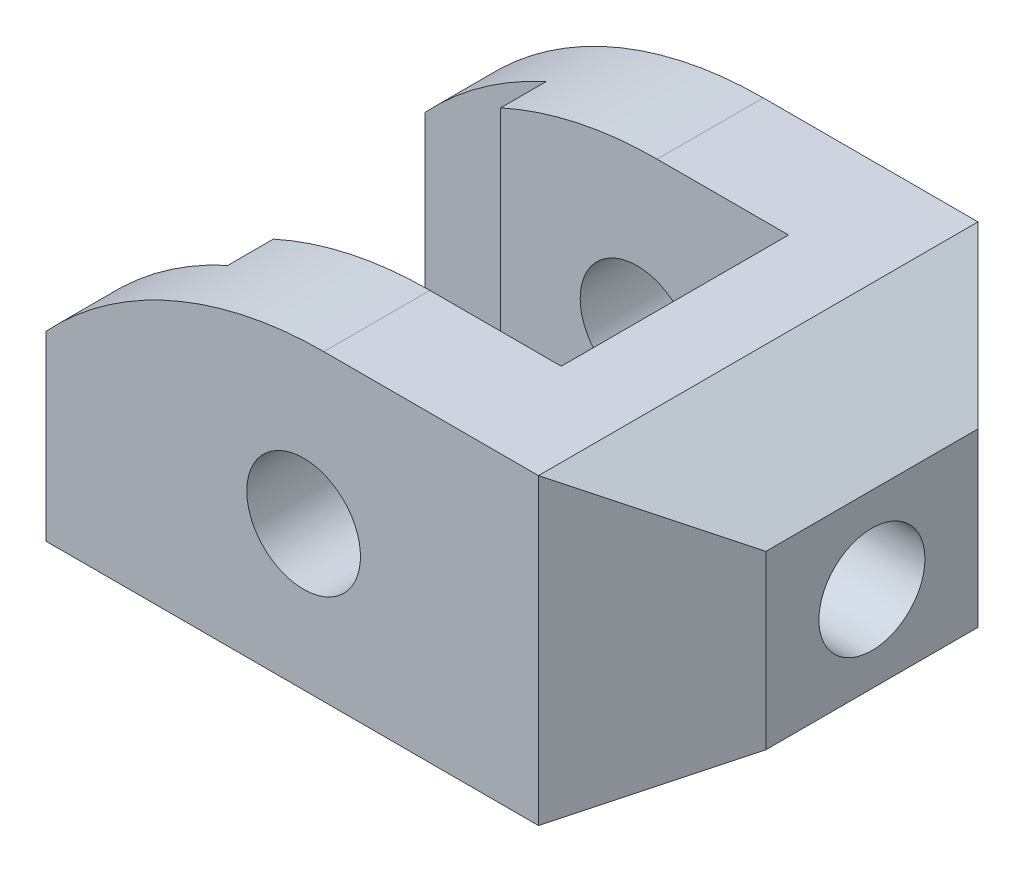
ISO-10303-21;
HEADER;
FILE_DESCRIPTION(('STEP AP214'),'2;1');
FILE_NAME('part.step','',(''),(''),'','','');
FILE_SCHEMA(('AUTOMOTIVE_DESIGN { 1 0 10303 214 1 1 1 1 }'));
ENDSEC;
DATA;
#1=APPLICATION_CONTEXT('core data for automotive mechanical design processes');
#2=APPLICATION_PROTOCOL_DEFINITION('international standard','automotive_design',2000,#1);
#3=PRODUCT_CONTEXT('',#1,'mechanical');
#4=PRODUCT('Part','Part','',(#3));
#5=PRODUCT_RELATED_PRODUCT_CATEGORY('part','',(#4));
#6=PRODUCT_DEFINITION_FORMATION('','',#4);
#7=PRODUCT_DEFINITION_CONTEXT('part definition',#1,'design');
#8=PRODUCT_DEFINITION('design','',#6,#7);
#9=PRODUCT_DEFINITION_SHAPE('','',#8);
#10=(LENGTH_UNIT() NAMED_UNIT(*) SI_UNIT(.MILLI.,.METRE.));
#11=(NAMED_UNIT(*) PLANE_ANGLE_UNIT() SI_UNIT($,.RADIAN.));
#12=(NAMED_UNIT(*) SI_UNIT($,.STERADIAN.) SOLID_ANGLE_UNIT());
#13=UNCERTAINTY_MEASURE_WITH_UNIT(LENGTH_MEASURE(1.E-05),#10,'distance_accuracy_value','');
#14=(GEOMETRIC_REPRESENTATION_CONTEXT(3) GLOBAL_UNCERTAINTY_ASSIGNED_CONTEXT((#13)) GLOBAL_UNIT_ASSIGNED_CONTEXT((#10,
#11,#12)) REPRESENTATION_CONTEXT('',''));
#15=CARTESIAN_POINT('',(0.,0.,0.));
#16=DIRECTION('',(0.,0.,1.));
#17=DIRECTION('',(1.,0.,0.));
#18=AXIS2_PLACEMENT_3D('',#15,#16,#17);
#19=CARTESIAN_POINT('',(36.6606055596467,-10.,29.));
#20=DIRECTION('',(0.,0.,-1.));
#21=DIRECTION('',(-1.,0.,0.));
#22=AXIS2_PLACEMENT_3D('',#19,#20,#21);
#23=CYLINDRICAL_SURFACE('',#22,50.);
#24=DIRECTION('',(0.,0.,-1.));
#25=VECTOR('',#24,1.);
#26=CARTESIAN_POINT('',(0.,24.,29.));
#27=LINE('',#26,#25);
#28=CARTESIAN_POINT('',(0.,24.,-21.));
#29=VERTEX_POINT('',#28);
#30=CARTESIAN_POINT('',(0.,24.,-29.));
#31=VERTEX_POINT('',#30);
#32=EDGE_CURVE('E261',#29,#31,#27,.T.);
#33=ORIENTED_EDGE('',*,*,#32,.F.);
#34=CARTESIAN_POINT('',(36.6606055596467,-10.,-21.));
#35=DIRECTION('',(0.,0.,-1.));
#36=DIRECTION('',(-1.,0.,0.));
#37=AXIS2_PLACEMENT_3D('',#34,#35,#36);
#38=CIRCLE('',#37,50.);
#39=CARTESIAN_POINT('',(16.,35.5317403347236,-21.));
#40=VERTEX_POINT('',#39);
#41=EDGE_CURVE('E222',#29,#40,#38,.T.);
#42=ORIENTED_EDGE('',*,*,#41,.T.);
#43=DIRECTION('',(0.,0.,-1.));
#44=VECTOR('',#43,1.);
#45=CARTESIAN_POINT('',(16.,35.5317403347236,29.));
#46=LINE('',#45,#44);
#47=CARTESIAN_POINT('',(16.,35.5317403347236,-15.));
#48=VERTEX_POINT('',#47);
#49=EDGE_CURVE('E287',#40,#48,#46,.F.);
#50=ORIENTED_EDGE('',*,*,#49,.T.);
#51=CARTESIAN_POINT('',(36.6606055596467,-10.,-15.));
#52=DIRECTION('',(0.,0.,-1.));
#53=DIRECTION('',(-1.,0.,0.));
#54=AXIS2_PLACEMENT_3D('',#51,#52,#53);
#55=CIRCLE('',#54,50.);
#56=CARTESIAN_POINT('',(36.6606055596467,40.,-15.));
#57=VERTEX_POINT('',#56);
#58=EDGE_CURVE('E217',#48,#57,#55,.T.);
#59=ORIENTED_EDGE('',*,*,#58,.T.);
#60=DIRECTION('',(0.,0.,-1.));
#61=VECTOR('',#60,1.);
#62=CARTESIAN_POINT('',(36.6606055596467,40.,29.));
#63=LINE('',#62,#61);
#64=CARTESIAN_POINT('',(36.6606055596467,40.,-29.));
#65=VERTEX_POINT('',#64);
#66=EDGE_CURVE('E179',#57,#65,#63,.T.);
#67=ORIENTED_EDGE('',*,*,#66,.T.);
#68=CARTESIAN_POINT('',(36.6606055596467,-10.,-29.));
#69=DIRECTION('',(0.,0.,1.));
#70=DIRECTION('',(-1.,0.,0.));
#71=AXIS2_PLACEMENT_3D('',#68,#69,#70);
#72=CIRCLE('',#71,50.);
#73=EDGE_CURVE('E253',#65,#31,#72,.T.);
#74=ORIENTED_EDGE('',*,*,#73,.T.);
#75=EDGE_LOOP('',(#33,#42,#50,#59,#67,#74));
#76=FACE_BOUND('',#75,.T.);
#77=ADVANCED_FACE('F42',(#76),#23,.T.);
#78=CARTESIAN_POINT('',(0.,0.,29.));
#79=DIRECTION('',(1.,0.,0.));
#80=DIRECTION('',(0.,0.,-1.));
#81=AXIS2_PLACEMENT_3D('',#78,#79,#80);
#82=PLANE('',#81);
#83=DIRECTION('',(0.,0.,-1.));
#84=VECTOR('',#83,1.);
#85=CARTESIAN_POINT('',(0.,0.,29.));
#86=LINE('',#85,#84);
#87=CARTESIAN_POINT('',(0.,0.,-21.));
#88=VERTEX_POINT('',#87);
#89=CARTESIAN_POINT('',(0.,0.,-29.));
#90=VERTEX_POINT('',#89);
#91=EDGE_CURVE('E248',#88,#90,#86,.T.);
#92=ORIENTED_EDGE('',*,*,#91,.F.);
#93=DIRECTION('',(0.,1.,0.));
#94=VECTOR('',#93,1.);
#95=CARTESIAN_POINT('',(0.,0.,-21.));
#96=LINE('',#95,#94);
#97=EDGE_CURVE('E184',#88,#29,#96,.T.);
#98=ORIENTED_EDGE('',*,*,#97,.T.);
#99=ORIENTED_EDGE('',*,*,#32,.T.);
#100=DIRECTION('',(0.,-1.,0.));
#101=VECTOR('',#100,1.);
#102=CARTESIAN_POINT('',(0.,0.,-29.));
#103=LINE('',#102,#101);
#104=EDGE_CURVE('E242',#31,#90,#103,.T.);
#105=ORIENTED_EDGE('',*,*,#104,.T.);
#106=EDGE_LOOP('',(#92,#98,#99,#105));
#107=FACE_BOUND('',#106,.T.);
#108=ADVANCED_FACE('F344',(#107),#82,.F.);
#109=CARTESIAN_POINT('',(34.,19.,29.));
#110=DIRECTION('',(0.,0.,-1.));
#111=DIRECTION('',(-1.,0.,0.));
#112=AXIS2_PLACEMENT_3D('',#109,#110,#111);
#113=CYLINDRICAL_SURFACE('',#112,7.5);
#114=CARTESIAN_POINT('',(34.,19.,-15.));
#115=DIRECTION('',(0.,0.,-1.));
#116=DIRECTION('',(-1.,0.,0.));
#117=AXIS2_PLACEMENT_3D('',#114,#115,#116);
#118=CIRCLE('',#117,7.5);
#119=CARTESIAN_POINT('',(26.5,19.,-15.));
#120=VERTEX_POINT('',#119);
#121=EDGE_CURVE('E216',#120,#120,#118,.T.);
#122=CARTESIAN_POINT('',(34.,19.,-29.));
#123=DIRECTION('',(0.,0.,1.));
#124=DIRECTION('',(1.,0.,0.));
#125=AXIS2_PLACEMENT_3D('',#122,#123,#124);
#126=CIRCLE('',#125,7.5);
#127=CARTESIAN_POINT('',(26.5,19.,-29.));
#128=VERTEX_POINT('',#127);
#129=EDGE_CURVE('E231',#128,#128,#126,.T.);
#130=CARTESIAN_POINT('',(26.5,19.,-15.));
#131=CARTESIAN_POINT('',(26.5,19.,-15.1458333333333));
#132=CARTESIAN_POINT('',(26.5,19.,-15.2916666666667));
#133=CARTESIAN_POINT('',(26.5,19.,-15.5833333333333));
#134=CARTESIAN_POINT('',(26.5,19.,-15.7291666666667));
#135=CARTESIAN_POINT('',(26.5,19.,-16.0208333333333));
#136=CARTESIAN_POINT('',(26.5,19.,-16.1666666666667));
#137=CARTESIAN_POINT('',(26.5,19.,-16.4583333333333));
#138=CARTESIAN_POINT('',(26.5,19.,-16.6041666666667));
#139=CARTESIAN_POINT('',(26.5,19.,-16.8958333333333));
#140=CARTESIAN_POINT('',(26.5,19.,-17.0416666666667));
#141=CARTESIAN_POINT('',(26.5,19.,-17.3333333333333));
#142=CARTESIAN_POINT('',(26.5,19.,-17.4791666666667));
#143=CARTESIAN_POINT('',(26.5,19.,-17.7708333333333));
#144=CARTESIAN_POINT('',(26.5,19.,-17.9166666666667));
#145=CARTESIAN_POINT('',(26.5,19.,-18.2083333333333));
#146=CARTESIAN_POINT('',(26.5,19.,-18.3541666666667));
#147=CARTESIAN_POINT('',(26.5,19.,-18.6458333333333));
#148=CARTESIAN_POINT('',(26.5,19.,-18.7916666666667));
#149=CARTESIAN_POINT('',(26.5,19.,-19.0833333333333));
#150=CARTESIAN_POINT('',(26.5,19.,-19.2291666666667));
#151=CARTESIAN_POINT('',(26.5,19.,-19.5208333333333));
#152=CARTESIAN_POINT('',(26.5,19.,-19.6666666666667));
#153=CARTESIAN_POINT('',(26.5,19.,-19.9583333333333));
#154=CARTESIAN_POINT('',(26.5,19.,-20.1041666666667));
#155=CARTESIAN_POINT('',(26.5,19.,-20.3958333333333));
#156=CARTESIAN_POINT('',(26.5,19.,-20.5416666666667));
#157=CARTESIAN_POINT('',(26.5,19.,-20.8333333333333));
#158=CARTESIAN_POINT('',(26.5,19.,-20.9791666666667));
#159=CARTESIAN_POINT('',(26.5,19.,-21.2708333333333));
#160=CARTESIAN_POINT('',(26.5,19.,-21.4166666666667));
#161=CARTESIAN_POINT('',(26.5,19.,-21.7083333333333));
#162=CARTESIAN_POINT('',(26.5,19.,-21.8541666666667));
#163=CARTESIAN_POINT('',(26.5,19.,-22.1458333333333));
#164=CARTESIAN_POINT('',(26.5,19.,-22.2916666666667));
#165=CARTESIAN_POINT('',(26.5,19.,-22.5833333333333));
#166=CARTESIAN_POINT('',(26.5,19.,-22.7291666666667));
#167=CARTESIAN_POINT('',(26.5,19.,-23.0208333333333));
#168=CARTESIAN_POINT('',(26.5,19.,-23.1666666666667));
#169=CARTESIAN_POINT('',(26.5,19.,-23.4583333333333));
#170=CARTESIAN_POINT('',(26.5,19.,-23.6041666666667));
#171=CARTESIAN_POINT('',(26.5,19.,-23.8958333333333));
#172=CARTESIAN_POINT('',(26.5,19.,-24.0416666666667));
#173=CARTESIAN_POINT('',(26.5,19.,-24.3333333333333));
#174=CARTESIAN_POINT('',(26.5,19.,-24.4791666666667));
#175=CARTESIAN_POINT('',(26.5,19.,-24.7708333333333));
#176=CARTESIAN_POINT('',(26.5,19.,-24.9166666666667));
#177=CARTESIAN_POINT('',(26.5,19.,-25.2083333333333));
#178=CARTESIAN_POINT('',(26.5,19.,-25.3541666666667));
#179=CARTESIAN_POINT('',(26.5,19.,-25.6458333333333));
#180=CARTESIAN_POINT('',(26.5,19.,-25.7916666666667));
#181=CARTESIAN_POINT('',(26.5,19.,-26.0833333333333));
#182=CARTESIAN_POINT('',(26.5,19.,-26.2291666666667));
#183=CARTESIAN_POINT('',(26.5,19.,-26.5208333333333));
#184=CARTESIAN_POINT('',(26.5,19.,-26.6666666666667));
#185=CARTESIAN_POINT('',(26.5,19.,-26.9583333333333));
#186=CARTESIAN_POINT('',(26.5,19.,-27.1041666666667));
#187=CARTESIAN_POINT('',(26.5,19.,-27.3958333333333));
#188=CARTESIAN_POINT('',(26.5,19.,-27.5416666666667));
#189=CARTESIAN_POINT('',(26.5,19.,-27.8333333333333));
#190=CARTESIAN_POINT('',(26.5,19.,-27.9791666666667));
#191=CARTESIAN_POINT('',(26.5,19.,-28.2708333333333));
#192=CARTESIAN_POINT('',(26.5,19.,-28.4166666666667));
#193=CARTESIAN_POINT('',(26.5,19.,-28.7083333333333));
#194=CARTESIAN_POINT('',(26.5,19.,-28.8541666666667));
#195=CARTESIAN_POINT('',(26.5,19.,-29.));
#196=B_SPLINE_CURVE_WITH_KNOTS('',3,(#130,#131,#132,#133,#134,#135,#136,#137,#138,#139,#140,
#141,#142,#143,#144,#145,#146,#147,#148,#149,#150,#151,#152,#153,#154,#155,#156,#157,#158,#159,
#160,#161,#162,#163,#164,#165,#166,#167,#168,#169,#170,#171,#172,#173,#174,#175,#176,#177,#178,
#179,#180,#181,#182,#183,#184,#185,#186,#187,#188,#189,#190,#191,#192,#193,#194,#195),
.UNSPECIFIED.,.F.,.F.,(4,2,2,2,2,2,2,2,2,2,2,2,2,2,2,2,2,2,2,2,2,2,2,2,2,2,2,2,2,2,2,2,4),(0.,
0.4375,0.875000000000001,1.3125,1.75,2.1875,2.625,3.0625,3.5,3.9375,4.375,4.8125,5.25,5.6875,
6.125,6.5625,7.,7.4375,7.875,8.3125,8.75,9.1875,9.62499999999999,10.0625,10.5,10.9375,11.375,
11.8125,12.25,12.6875,13.125,13.5625,14.),.UNSPECIFIED.);
#197=EDGE_CURVE('BSEAM350',#120,#128,#196,.T.);
#198=ORIENTED_EDGE('',*,*,#121,.F.);
#199=ORIENTED_EDGE('',*,*,#129,.F.);
#200=ORIENTED_EDGE('',*,*,#197,.T.);
#201=ORIENTED_EDGE('',*,*,#197,.F.);
#202=EDGE_LOOP('',(#198,#200,#199,#201));
#203=FACE_BOUND('',#202,.T.);
#204=ADVANCED_FACE('F350',(#203),#113,.F.);
#205=CARTESIAN_POINT('',(36.6606055596467,-10.,29.));
#206=DIRECTION('',(0.,0.,-1.));
#207=DIRECTION('',(-1.,0.,0.));
#208=AXIS2_PLACEMENT_3D('',#205,#206,#207);
#209=PLANE('',#208);
#210=DIRECTION('',(1.,0.,0.));
#211=VECTOR('',#210,1.);
#212=CARTESIAN_POINT('',(0.,0.,29.));
#213=LINE('',#212,#211);
#214=CARTESIAN_POINT('',(0.,0.,29.));
#215=VERTEX_POINT('',#214);
#216=CARTESIAN_POINT('',(65.,0.,29.));
#217=VERTEX_POINT('',#216);
#218=EDGE_CURVE('E238',#215,#217,#213,.T.);
#219=ORIENTED_EDGE('',*,*,#218,.T.);
#220=DIRECTION('',(0.,1.,0.));
#221=VECTOR('',#220,1.);
#222=CARTESIAN_POINT('',(65.,0.,29.));
#223=LINE('',#222,#221);
#224=CARTESIAN_POINT('',(65.,40.,29.));
#225=VERTEX_POINT('',#224);
#226=EDGE_CURVE('E205',#217,#225,#223,.T.);
#227=ORIENTED_EDGE('',*,*,#226,.T.);
#228=DIRECTION('',(-1.,0.,0.));
#229=VECTOR('',#228,1.);
#230=CARTESIAN_POINT('',(65.,40.,29.));
#231=LINE('',#230,#229);
#232=CARTESIAN_POINT('',(36.6606055596467,40.,29.));
#233=VERTEX_POINT('',#232);
#234=EDGE_CURVE('E241',#225,#233,#231,.T.);
#235=ORIENTED_EDGE('',*,*,#234,.T.);
#236=CARTESIAN_POINT('',(36.6606055596467,-10.,29.));
#237=DIRECTION('',(0.,0.,1.));
#238=DIRECTION('',(-1.,0.,0.));
#239=AXIS2_PLACEMENT_3D('',#236,#237,#238);
#240=CIRCLE('',#239,50.);
#241=CARTESIAN_POINT('',(0.,24.,29.));
#242=VERTEX_POINT('',#241);
#243=EDGE_CURVE('E244',#233,#242,#240,.T.);
#244=ORIENTED_EDGE('',*,*,#243,.T.);
#245=DIRECTION('',(0.,-1.,0.));
#246=VECTOR('',#245,1.);
#247=CARTESIAN_POINT('',(0.,0.,29.));
#248=LINE('',#247,#246);
#249=EDGE_CURVE('E246',#242,#215,#248,.T.);
#250=ORIENTED_EDGE('',*,*,#249,.T.);
#251=EDGE_LOOP('',(#219,#227,#235,#244,#250));
#252=FACE_BOUND('',#251,.T.);
#253=CARTESIAN_POINT('',(34.,19.,29.));
#254=DIRECTION('',(0.,0.,1.));
#255=DIRECTION('',(1.,0.,0.));
#256=AXIS2_PLACEMENT_3D('',#253,#254,#255);
#257=CIRCLE('',#256,7.5);
#258=CARTESIAN_POINT('',(26.5,19.,29.));
#259=VERTEX_POINT('',#258);
#260=EDGE_CURVE('E232',#259,#259,#257,.T.);
#261=ORIENTED_EDGE('',*,*,#260,.F.);
#262=EDGE_LOOP('',(#261));
#263=FACE_BOUND('',#262,.T.);
#264=ADVANCED_FACE('F375',(#252,#263),#209,.F.);
#265=CARTESIAN_POINT('',(36.6606055596467,-10.,-29.));
#266=DIRECTION('',(0.,0.,-1.));
#267=DIRECTION('',(-1.,0.,0.));
#268=AXIS2_PLACEMENT_3D('',#265,#266,#267);
#269=PLANE('',#268);
#270=DIRECTION('',(0.,1.,0.));
#271=VECTOR('',#270,1.);
#272=CARTESIAN_POINT('',(65.,0.,-29.));
#273=LINE('',#272,#271);
#274=CARTESIAN_POINT('',(65.,0.,-29.));
#275=VERTEX_POINT('',#274);
#276=CARTESIAN_POINT('',(65.,40.,-29.));
#277=VERTEX_POINT('',#276);
#278=EDGE_CURVE('E208',#275,#277,#273,.T.);
#279=ORIENTED_EDGE('',*,*,#278,.F.);
#280=DIRECTION('',(1.,0.,0.));
#281=VECTOR('',#280,1.);
#282=CARTESIAN_POINT('',(0.,0.,-29.));
#283=LINE('',#282,#281);
#284=EDGE_CURVE('E235',#90,#275,#283,.T.);
#285=ORIENTED_EDGE('',*,*,#284,.F.);
#286=ORIENTED_EDGE('',*,*,#104,.F.);
#287=ORIENTED_EDGE('',*,*,#73,.F.);
#288=DIRECTION('',(-1.,0.,0.));
#289=VECTOR('',#288,1.);
#290=CARTESIAN_POINT('',(65.,40.,-29.));
#291=LINE('',#290,#289);
#292=EDGE_CURVE('E251',#277,#65,#291,.T.);
#293=ORIENTED_EDGE('',*,*,#292,.F.);
#294=EDGE_LOOP('',(#279,#285,#286,#287,#293));
#295=FACE_BOUND('',#294,.T.);
#296=ORIENTED_EDGE('',*,*,#129,.T.);
#297=EDGE_LOOP('',(#296));
#298=FACE_BOUND('',#297,.T.);
#299=ADVANCED_FACE('F302',(#295,#298),#269,.T.);
#300=CARTESIAN_POINT('',(0.,0.,29.));
#301=DIRECTION('',(0.,1.,0.));
#302=DIRECTION('',(0.,0.,1.));
#303=AXIS2_PLACEMENT_3D('',#300,#301,#302);
#304=PLANE('',#303);
#305=DIRECTION('',(0.,0.,-1.));
#306=VECTOR('',#305,1.);
#307=CARTESIAN_POINT('',(16.,0.,-21.));
#308=LINE('',#307,#306);
#309=CARTESIAN_POINT('',(16.,0.,-15.));
#310=VERTEX_POINT('',#309);
#311=CARTESIAN_POINT('',(16.,0.,-21.));
#312=VERTEX_POINT('',#311);
#313=EDGE_CURVE('E192',#310,#312,#308,.T.);
#314=ORIENTED_EDGE('',*,*,#313,.T.);
#315=DIRECTION('',(-1.,0.,0.));
#316=VECTOR('',#315,1.);
#317=CARTESIAN_POINT('',(0.,0.,-21.));
#318=LINE('',#317,#316);
#319=EDGE_CURVE('E189',#312,#88,#318,.T.);
#320=ORIENTED_EDGE('',*,*,#319,.T.);
#321=ORIENTED_EDGE('',*,*,#91,.T.);
#322=ORIENTED_EDGE('',*,*,#284,.T.);
#323=DIRECTION('',(0.,0.,-1.));
#324=VECTOR('',#323,1.);
#325=CARTESIAN_POINT('',(65.,0.,29.));
#326=LINE('',#325,#324);
#327=EDGE_CURVE('E277',#217,#275,#326,.T.);
#328=ORIENTED_EDGE('',*,*,#327,.F.);
#329=ORIENTED_EDGE('',*,*,#218,.F.);
#330=CARTESIAN_POINT('',(0.,0.,21.));
#331=VERTEX_POINT('',#330);
#332=EDGE_CURVE('E258',#215,#331,#86,.T.);
#333=ORIENTED_EDGE('',*,*,#332,.T.);
#334=DIRECTION('',(1.,0.,0.));
#335=VECTOR('',#334,1.);
#336=CARTESIAN_POINT('',(0.,0.,21.));
#337=LINE('',#336,#335);
#338=CARTESIAN_POINT('',(16.,0.,21.));
#339=VERTEX_POINT('',#338);
#340=EDGE_CURVE('E65',#331,#339,#337,.T.);
#341=ORIENTED_EDGE('',*,*,#340,.T.);
#342=DIRECTION('',(0.,0.,-1.));
#343=VECTOR('',#342,1.);
#344=CARTESIAN_POINT('',(16.,0.,21.));
#345=LINE('',#344,#343);
#346=CARTESIAN_POINT('',(16.,0.,15.));
#347=VERTEX_POINT('',#346);
#348=EDGE_CURVE('E181',#339,#347,#345,.T.);
#349=ORIENTED_EDGE('',*,*,#348,.T.);
#350=DIRECTION('',(1.,0.,0.));
#351=VECTOR('',#350,1.);
#352=CARTESIAN_POINT('',(16.,0.,15.));
#353=LINE('',#352,#351);
#354=CARTESIAN_POINT('',(54.,0.,15.));
#355=VERTEX_POINT('',#354);
#356=EDGE_CURVE('E199',#347,#355,#353,.T.);
#357=ORIENTED_EDGE('',*,*,#356,.T.);
#358=DIRECTION('',(0.,0.,-1.));
#359=VECTOR('',#358,1.);
#360=CARTESIAN_POINT('',(54.,0.,-15.));
#361=LINE('',#360,#359);
#362=CARTESIAN_POINT('',(54.,0.,-15.));
#363=VERTEX_POINT('',#362);
#364=EDGE_CURVE('E197',#355,#363,#361,.T.);
#365=ORIENTED_EDGE('',*,*,#364,.T.);
#366=DIRECTION('',(-1.,0.,0.));
#367=VECTOR('',#366,1.);
#368=CARTESIAN_POINT('',(16.,0.,-15.));
#369=LINE('',#368,#367);
#370=EDGE_CURVE('E161',#363,#310,#369,.T.);
#371=ORIENTED_EDGE('',*,*,#370,.T.);
#372=EDGE_LOOP('',(#314,#320,#321,#322,#328,#329,#333,#341,#349,#357,#365,#371));
#373=FACE_BOUND('',#372,.T.);
#374=ADVANCED_FACE('F44',(#373),#304,.F.);
#375=CARTESIAN_POINT('',(65.,0.,29.));
#376=DIRECTION('',(-0.500000000000001,0.866025403784438,0.));
#377=DIRECTION('',(-0.866025403784438,-0.500000000000001,0.));
#378=AXIS2_PLACEMENT_3D('',#375,#376,#377);
#379=PLANE('',#378);
#380=DIRECTION('',(0.,0.,-1.));
#381=VECTOR('',#380,1.);
#382=CARTESIAN_POINT('',(80.,8.66025403784441,29.));
#383=LINE('',#382,#381);
#384=CARTESIAN_POINT('',(80.,8.66025403784441,14.0000000000002));
#385=VERTEX_POINT('',#384);
#386=CARTESIAN_POINT('',(80.,8.66025403784441,-14.0000000000002));
#387=VERTEX_POINT('',#386);
#388=EDGE_CURVE('E274',#385,#387,#383,.T.);
#389=ORIENTED_EDGE('',*,*,#388,.F.);
#390=DIRECTION('',(-0.65465367070798,-0.37796447300923,0.654653670707973));
#391=VECTOR('',#390,1.);
#392=CARTESIAN_POINT('',(65.,0.,29.));
#393=LINE('',#392,#391);
#394=EDGE_CURVE('E228',#385,#217,#393,.T.);
#395=ORIENTED_EDGE('',*,*,#394,.T.);
#396=ORIENTED_EDGE('',*,*,#327,.T.);
#397=DIRECTION('',(0.65465367070798,0.37796447300923,0.654653670707973));
#398=VECTOR('',#397,1.);
#399=CARTESIAN_POINT('',(89.8571428571428,14.3512781198564,-4.14285714285749));
#400=LINE('',#399,#398);
#401=EDGE_CURVE('E225',#275,#387,#400,.T.);
#402=ORIENTED_EDGE('',*,*,#401,.T.);
#403=EDGE_LOOP('',(#389,#395,#396,#402));
#404=FACE_BOUND('',#403,.T.);
#405=ADVANCED_FACE('F380',(#404),#379,.F.);
#406=CARTESIAN_POINT('',(80.,8.66025403784441,29.));
#407=DIRECTION('',(-1.,0.,0.));
#408=DIRECTION('',(0.,0.,1.));
#409=AXIS2_PLACEMENT_3D('',#406,#407,#408);
#410=PLANE('',#409);
#411=CARTESIAN_POINT('',(80.,20.0000000000001,0.));
#412=DIRECTION('',(1.,0.,0.));
#413=DIRECTION('',(0.,0.,-1.));
#414=AXIS2_PLACEMENT_3D('',#411,#412,#413);
#415=CIRCLE('',#414,7.);
#416=CARTESIAN_POINT('',(80.,20.0000000000001,-6.99999999999999));
#417=VERTEX_POINT('',#416);
#418=EDGE_CURVE('E324',#417,#417,#415,.T.);
#419=ORIENTED_EDGE('',*,*,#418,.F.);
#420=EDGE_LOOP('',(#419));
#421=FACE_BOUND('',#420,.T.);
#422=DIRECTION('',(0.,0.,-1.));
#423=VECTOR('',#422,1.);
#424=CARTESIAN_POINT('',(80.,31.3397459621557,29.));
#425=LINE('',#424,#423);
#426=CARTESIAN_POINT('',(80.,31.3397459621557,14.0000000000002));
#427=VERTEX_POINT('',#426);
#428=CARTESIAN_POINT('',(80.,31.3397459621557,-14.0000000000002));
#429=VERTEX_POINT('',#428);
#430=EDGE_CURVE('E271',#427,#429,#425,.T.);
#431=ORIENTED_EDGE('',*,*,#430,.F.);
#432=DIRECTION('',(0.,1.,0.));
#433=VECTOR('',#432,1.);
#434=CARTESIAN_POINT('',(80.,0.,14.0000000000002));
#435=LINE('',#434,#433);
#436=EDGE_CURVE('E58',#385,#427,#435,.T.);
#437=ORIENTED_EDGE('',*,*,#436,.F.);
#438=ORIENTED_EDGE('',*,*,#388,.T.);
#439=DIRECTION('',(0.,1.,0.));
#440=VECTOR('',#439,1.);
#441=CARTESIAN_POINT('',(80.,0.,-14.0000000000002));
#442=LINE('',#441,#440);
#443=EDGE_CURVE('E188',#387,#429,#442,.T.);
#444=ORIENTED_EDGE('',*,*,#443,.T.);
#445=EDGE_LOOP('',(#431,#437,#438,#444));
#446=FACE_BOUND('',#445,.T.);
#447=ADVANCED_FACE('F382',(#421,#446),#410,.F.);
#448=CARTESIAN_POINT('',(80.,31.3397459621557,29.));
#449=DIRECTION('',(-0.499999999999995,-0.866025403784441,0.));
#450=DIRECTION('',(0.866025403784442,-0.499999999999995,0.));
#451=AXIS2_PLACEMENT_3D('',#448,#449,#450);
#452=PLANE('',#451);
#453=DIRECTION('',(0.,0.,-1.));
#454=VECTOR('',#453,1.);
#455=CARTESIAN_POINT('',(65.,40.,29.));
#456=LINE('',#455,#454);
#457=EDGE_CURVE('E268',#225,#277,#456,.T.);
#458=ORIENTED_EDGE('',*,*,#457,.F.);
#459=DIRECTION('',(0.654653670707982,-0.377964473009225,-0.654653670707974));
#460=VECTOR('',#459,1.);
#461=CARTESIAN_POINT('',(73.5714285714286,35.0512834069461,20.4285714285715));
#462=LINE('',#461,#460);
#463=EDGE_CURVE('E11',#225,#427,#462,.T.);
#464=ORIENTED_EDGE('',*,*,#463,.T.);
#465=ORIENTED_EDGE('',*,*,#430,.T.);
#466=DIRECTION('',(-0.654653670707982,0.377964473009225,-0.654653670707974));
#467=VECTOR('',#466,1.);
#468=CARTESIAN_POINT('',(98.4285714285715,20.7000052870898,4.42857142857117));
#469=LINE('',#468,#467);
#470=EDGE_CURVE('E51',#429,#277,#469,.T.);
#471=ORIENTED_EDGE('',*,*,#470,.T.);
#472=EDGE_LOOP('',(#458,#464,#465,#471));
#473=FACE_BOUND('',#472,.T.);
#474=ADVANCED_FACE('F293',(#473),#452,.F.);
#475=CARTESIAN_POINT('',(65.,40.,29.));
#476=DIRECTION('',(0.,-1.,0.));
#477=DIRECTION('',(1.,0.,0.));
#478=AXIS2_PLACEMENT_3D('',#475,#476,#477);
#479=PLANE('',#478);
#480=ORIENTED_EDGE('',*,*,#66,.F.);
#481=DIRECTION('',(-1.,0.,0.));
#482=VECTOR('',#481,1.);
#483=CARTESIAN_POINT('',(16.,40.,-15.));
#484=LINE('',#483,#482);
#485=CARTESIAN_POINT('',(54.,40.,-15.));
#486=VERTEX_POINT('',#485);
#487=EDGE_CURVE('E158',#486,#57,#484,.T.);
#488=ORIENTED_EDGE('',*,*,#487,.F.);
#489=DIRECTION('',(0.,0.,-1.));
#490=VECTOR('',#489,1.);
#491=CARTESIAN_POINT('',(54.,40.,-15.));
#492=LINE('',#491,#490);
#493=CARTESIAN_POINT('',(54.,40.,15.));
#494=VERTEX_POINT('',#493);
#495=EDGE_CURVE('E170',#494,#486,#492,.T.);
#496=ORIENTED_EDGE('',*,*,#495,.F.);
#497=DIRECTION('',(1.,0.,0.));
#498=VECTOR('',#497,1.);
#499=CARTESIAN_POINT('',(16.,40.,15.));
#500=LINE('',#499,#498);
#501=CARTESIAN_POINT('',(36.6606055596467,40.,15.));
#502=VERTEX_POINT('',#501);
#503=EDGE_CURVE('E174',#502,#494,#500,.T.);
#504=ORIENTED_EDGE('',*,*,#503,.F.);
#505=EDGE_CURVE('E265',#233,#502,#63,.T.);
#506=ORIENTED_EDGE('',*,*,#505,.F.);
#507=ORIENTED_EDGE('',*,*,#234,.F.);
#508=ORIENTED_EDGE('',*,*,#457,.T.);
#509=ORIENTED_EDGE('',*,*,#292,.T.);
#510=EDGE_LOOP('',(#480,#488,#496,#504,#506,#507,#508,#509));
#511=FACE_BOUND('',#510,.T.);
#512=ADVANCED_FACE('F177',(#511),#479,.F.);
#513=ORIENTED_EDGE('',*,*,#505,.T.);
#514=CARTESIAN_POINT('',(36.6606055596467,-10.,15.));
#515=DIRECTION('',(0.,0.,1.));
#516=DIRECTION('',(1.,0.,0.));
#517=AXIS2_PLACEMENT_3D('',#514,#515,#516);
#518=CIRCLE('',#517,50.);
#519=CARTESIAN_POINT('',(16.,35.5317403347236,15.));
#520=VERTEX_POINT('',#519);
#521=EDGE_CURVE('E213',#502,#520,#518,.T.);
#522=ORIENTED_EDGE('',*,*,#521,.T.);
#523=DIRECTION('',(0.,0.,-1.));
#524=VECTOR('',#523,1.);
#525=CARTESIAN_POINT('',(16.,35.5317403347236,29.));
#526=LINE('',#525,#524);
#527=CARTESIAN_POINT('',(16.,35.5317403347236,21.));
#528=VERTEX_POINT('',#527);
#529=EDGE_CURVE('E280',#520,#528,#526,.F.);
#530=ORIENTED_EDGE('',*,*,#529,.T.);
#531=CARTESIAN_POINT('',(36.6606055596467,-10.,21.));
#532=DIRECTION('',(0.,0.,1.));
#533=DIRECTION('',(1.,0.,0.));
#534=AXIS2_PLACEMENT_3D('',#531,#532,#533);
#535=CIRCLE('',#534,50.);
#536=CARTESIAN_POINT('',(0.,24.,21.));
#537=VERTEX_POINT('',#536);
#538=EDGE_CURVE('E219',#528,#537,#535,.T.);
#539=ORIENTED_EDGE('',*,*,#538,.T.);
#540=EDGE_CURVE('E262',#242,#537,#27,.T.);
#541=ORIENTED_EDGE('',*,*,#540,.F.);
#542=ORIENTED_EDGE('',*,*,#243,.F.);
#543=EDGE_LOOP('',(#513,#522,#530,#539,#541,#542));
#544=FACE_BOUND('',#543,.T.);
#545=ADVANCED_FACE('F346',(#544),#23,.T.);
#546=ORIENTED_EDGE('',*,*,#540,.T.);
#547=DIRECTION('',(0.,1.,0.));
#548=VECTOR('',#547,1.);
#549=CARTESIAN_POINT('',(0.,0.,21.));
#550=LINE('',#549,#548);
#551=EDGE_CURVE('E193',#331,#537,#550,.T.);
#552=ORIENTED_EDGE('',*,*,#551,.F.);
#553=ORIENTED_EDGE('',*,*,#332,.F.);
#554=ORIENTED_EDGE('',*,*,#249,.F.);
#555=EDGE_LOOP('',(#546,#552,#553,#554));
#556=FACE_BOUND('',#555,.T.);
#557=ADVANCED_FACE('F353',(#556),#82,.F.);
#558=CARTESIAN_POINT('',(34.,19.,15.));
#559=DIRECTION('',(0.,0.,1.));
#560=DIRECTION('',(1.,0.,0.));
#561=AXIS2_PLACEMENT_3D('',#558,#559,#560);
#562=CIRCLE('',#561,7.5);
#563=CARTESIAN_POINT('',(26.5,19.,15.));
#564=VERTEX_POINT('',#563);
#565=EDGE_CURVE('E210',#564,#564,#562,.T.);
#566=CARTESIAN_POINT('',(26.5,19.,15.));
#567=CARTESIAN_POINT('',(26.5,19.,15.1458333333333));
#568=CARTESIAN_POINT('',(26.5,19.,15.2916666666667));
#569=CARTESIAN_POINT('',(26.5,19.,15.5833333333333));
#570=CARTESIAN_POINT('',(26.5,19.,15.7291666666667));
#571=CARTESIAN_POINT('',(26.5,19.,16.0208333333333));
#572=CARTESIAN_POINT('',(26.5,19.,16.1666666666667));
#573=CARTESIAN_POINT('',(26.5,19.,16.4583333333333));
#574=CARTESIAN_POINT('',(26.5,19.,16.6041666666667));
#575=CARTESIAN_POINT('',(26.5,19.,16.8958333333333));
#576=CARTESIAN_POINT('',(26.5,19.,17.0416666666667));
#577=CARTESIAN_POINT('',(26.5,19.,17.3333333333333));
#578=CARTESIAN_POINT('',(26.5,19.,17.4791666666667));
#579=CARTESIAN_POINT('',(26.5,19.,17.7708333333333));
#580=CARTESIAN_POINT('',(26.5,19.,17.9166666666667));
#581=CARTESIAN_POINT('',(26.5,19.,18.2083333333333));
#582=CARTESIAN_POINT('',(26.5,19.,18.3541666666667));
#583=CARTESIAN_POINT('',(26.5,19.,18.6458333333333));
#584=CARTESIAN_POINT('',(26.5,19.,18.7916666666667));
#585=CARTESIAN_POINT('',(26.5,19.,19.0833333333333));
#586=CARTESIAN_POINT('',(26.5,19.,19.2291666666667));
#587=CARTESIAN_POINT('',(26.5,19.,19.5208333333333));
#588=CARTESIAN_POINT('',(26.5,19.,19.6666666666667));
#589=CARTESIAN_POINT('',(26.5,19.,19.9583333333333));
#590=CARTESIAN_POINT('',(26.5,19.,20.1041666666667));
#591=CARTESIAN_POINT('',(26.5,19.,20.3958333333333));
#592=CARTESIAN_POINT('',(26.5,19.,20.5416666666667));
#593=CARTESIAN_POINT('',(26.5,19.,20.8333333333333));
#594=CARTESIAN_POINT('',(26.5,19.,20.9791666666667));
#595=CARTESIAN_POINT('',(26.5,19.,21.2708333333333));
#596=CARTESIAN_POINT('',(26.5,19.,21.4166666666667));
#597=CARTESIAN_POINT('',(26.5,19.,21.7083333333333));
#598=CARTESIAN_POINT('',(26.5,19.,21.8541666666667));
#599=CARTESIAN_POINT('',(26.5,19.,22.1458333333333));
#600=CARTESIAN_POINT('',(26.5,19.,22.2916666666667));
#601=CARTESIAN_POINT('',(26.5,19.,22.5833333333333));
#602=CARTESIAN_POINT('',(26.5,19.,22.7291666666667));
#603=CARTESIAN_POINT('',(26.5,19.,23.0208333333333));
#604=CARTESIAN_POINT('',(26.5,19.,23.1666666666667));
#605=CARTESIAN_POINT('',(26.5,19.,23.4583333333333));
#606=CARTESIAN_POINT('',(26.5,19.,23.6041666666667));
#607=CARTESIAN_POINT('',(26.5,19.,23.8958333333333));
#608=CARTESIAN_POINT('',(26.5,19.,24.0416666666667));
#609=CARTESIAN_POINT('',(26.5,19.,24.3333333333333));
#610=CARTESIAN_POINT('',(26.5,19.,24.4791666666667));
#611=CARTESIAN_POINT('',(26.5,19.,24.7708333333333));
#612=CARTESIAN_POINT('',(26.5,19.,24.9166666666667));
#613=CARTESIAN_POINT('',(26.5,19.,25.2083333333333));
#614=CARTESIAN_POINT('',(26.5,19.,25.3541666666667));
#615=CARTESIAN_POINT('',(26.5,19.,25.6458333333333));
#616=CARTESIAN_POINT('',(26.5,19.,25.7916666666667));
#617=CARTESIAN_POINT('',(26.5,19.,26.0833333333333));
#618=CARTESIAN_POINT('',(26.5,19.,26.2291666666667));
#619=CARTESIAN_POINT('',(26.5,19.,26.5208333333333));
#620=CARTESIAN_POINT('',(26.5,19.,26.6666666666667));
#621=CARTESIAN_POINT('',(26.5,19.,26.9583333333333));
#622=CARTESIAN_POINT('',(26.5,19.,27.1041666666667));
#623=CARTESIAN_POINT('',(26.5,19.,27.3958333333333));
#624=CARTESIAN_POINT('',(26.5,19.,27.5416666666667));
#625=CARTESIAN_POINT('',(26.5,19.,27.8333333333333));
#626=CARTESIAN_POINT('',(26.5,19.,27.9791666666667));
#627=CARTESIAN_POINT('',(26.5,19.,28.2708333333333));
#628=CARTESIAN_POINT('',(26.5,19.,28.4166666666667));
#629=CARTESIAN_POINT('',(26.5,19.,28.7083333333333));
#630=CARTESIAN_POINT('',(26.5,19.,28.8541666666667));
#631=CARTESIAN_POINT('',(26.5,19.,29.));
#632=B_SPLINE_CURVE_WITH_KNOTS('',3,(#566,#567,#568,#569,#570,#571,#572,#573,#574,#575,#576,
#577,#578,#579,#580,#581,#582,#583,#584,#585,#586,#587,#588,#589,#590,#591,#592,#593,#594,#595,
#596,#597,#598,#599,#600,#601,#602,#603,#604,#605,#606,#607,#608,#609,#610,#611,#612,#613,#614,
#615,#616,#617,#618,#619,#620,#621,#622,#623,#624,#625,#626,#627,#628,#629,#630,#631),
.UNSPECIFIED.,.F.,.F.,(4,2,2,2,2,2,2,2,2,2,2,2,2,2,2,2,2,2,2,2,2,2,2,2,2,2,2,2,2,2,2,2,4),(0.,
0.4375,0.874999999999999,1.3125,1.75,2.1875,2.625,3.0625,3.5,3.9375,4.375,4.8125,5.25,5.6875,
6.125,6.5625,7.,7.43749999999999,7.87499999999999,8.31249999999999,8.75,9.1875,9.62499999999999,
10.0625,10.5,10.9375,11.375,11.8125,12.25,12.6875,13.125,13.5625,14.),.UNSPECIFIED.);
#633=EDGE_CURVE('BSEAM361',#564,#259,#632,.T.);
#634=ORIENTED_EDGE('',*,*,#565,.F.);
#635=ORIENTED_EDGE('',*,*,#260,.T.);
#636=ORIENTED_EDGE('',*,*,#633,.T.);
#637=ORIENTED_EDGE('',*,*,#633,.F.);
#638=EDGE_LOOP('',(#634,#636,#635,#637));
#639=FACE_BOUND('',#638,.T.);
#640=ADVANCED_FACE('F361',(#639),#113,.F.);
#641=CARTESIAN_POINT('',(16.,0.,-21.));
#642=DIRECTION('',(1.,0.,0.));
#643=DIRECTION('',(0.,1.,0.));
#644=AXIS2_PLACEMENT_3D('',#641,#642,#643);
#645=PLANE('',#644);
#646=DIRECTION('',(0.,1.,0.));
#647=VECTOR('',#646,1.);
#648=CARTESIAN_POINT('',(16.,0.,-21.));
#649=LINE('',#648,#647);
#650=EDGE_CURVE('E313',#312,#40,#649,.T.);
#651=ORIENTED_EDGE('',*,*,#650,.F.);
#652=ORIENTED_EDGE('',*,*,#313,.F.);
#653=DIRECTION('',(0.,1.,0.));
#654=VECTOR('',#653,1.);
#655=CARTESIAN_POINT('',(16.,0.,-15.));
#656=LINE('',#655,#654);
#657=EDGE_CURVE('E166',#310,#48,#656,.T.);
#658=ORIENTED_EDGE('',*,*,#657,.T.);
#659=ORIENTED_EDGE('',*,*,#49,.F.);
#660=EDGE_LOOP('',(#651,#652,#658,#659));
#661=FACE_BOUND('',#660,.T.);
#662=ADVANCED_FACE('F311',(#661),#645,.F.);
#663=CARTESIAN_POINT('',(16.,0.,21.));
#664=DIRECTION('',(1.,0.,0.));
#665=DIRECTION('',(0.,0.,-1.));
#666=AXIS2_PLACEMENT_3D('',#663,#664,#665);
#667=PLANE('',#666);
#668=DIRECTION('',(0.,1.,0.));
#669=VECTOR('',#668,1.);
#670=CARTESIAN_POINT('',(16.,0.,15.));
#671=LINE('',#670,#669);
#672=EDGE_CURVE('E317',#347,#520,#671,.T.);
#673=ORIENTED_EDGE('',*,*,#672,.F.);
#674=ORIENTED_EDGE('',*,*,#348,.F.);
#675=DIRECTION('',(0.,1.,0.));
#676=VECTOR('',#675,1.);
#677=CARTESIAN_POINT('',(16.,0.,21.));
#678=LINE('',#677,#676);
#679=EDGE_CURVE('E320',#339,#528,#678,.T.);
#680=ORIENTED_EDGE('',*,*,#679,.T.);
#681=ORIENTED_EDGE('',*,*,#529,.F.);
#682=EDGE_LOOP('',(#673,#674,#680,#681));
#683=FACE_BOUND('',#682,.T.);
#684=ADVANCED_FACE('F370',(#683),#667,.F.);
#685=CARTESIAN_POINT('',(0.,0.,-21.));
#686=DIRECTION('',(0.,0.,-1.));
#687=DIRECTION('',(-1.,0.,0.));
#688=AXIS2_PLACEMENT_3D('',#685,#686,#687);
#689=PLANE('',#688);
#690=ORIENTED_EDGE('',*,*,#97,.F.);
#691=ORIENTED_EDGE('',*,*,#319,.F.);
#692=ORIENTED_EDGE('',*,*,#650,.T.);
#693=ORIENTED_EDGE('',*,*,#41,.F.);
#694=EDGE_LOOP('',(#690,#691,#692,#693));
#695=FACE_BOUND('',#694,.T.);
#696=ADVANCED_FACE('F408',(#695),#689,.F.);
#697=CARTESIAN_POINT('',(0.,0.,21.));
#698=DIRECTION('',(0.,0.,1.));
#699=DIRECTION('',(1.,0.,0.));
#700=AXIS2_PLACEMENT_3D('',#697,#698,#699);
#701=PLANE('',#700);
#702=ORIENTED_EDGE('',*,*,#679,.F.);
#703=ORIENTED_EDGE('',*,*,#340,.F.);
#704=ORIENTED_EDGE('',*,*,#551,.T.);
#705=ORIENTED_EDGE('',*,*,#538,.F.);
#706=EDGE_LOOP('',(#702,#703,#704,#705));
#707=FACE_BOUND('',#706,.T.);
#708=ADVANCED_FACE('F410',(#707),#701,.F.);
#709=CARTESIAN_POINT('',(16.,0.,-15.));
#710=DIRECTION('',(0.,0.,-1.));
#711=DIRECTION('',(-1.,0.,0.));
#712=AXIS2_PLACEMENT_3D('',#709,#710,#711);
#713=PLANE('',#712);
#714=ORIENTED_EDGE('',*,*,#121,.T.);
#715=EDGE_LOOP('',(#714));
#716=FACE_BOUND('',#715,.T.);
#717=ORIENTED_EDGE('',*,*,#657,.F.);
#718=ORIENTED_EDGE('',*,*,#370,.F.);
#719=DIRECTION('',(0.,1.,0.));
#720=VECTOR('',#719,1.);
#721=CARTESIAN_POINT('',(54.,0.,-15.));
#722=LINE('',#721,#720);
#723=EDGE_CURVE('E154',#363,#486,#722,.T.);
#724=ORIENTED_EDGE('',*,*,#723,.T.);
#725=ORIENTED_EDGE('',*,*,#487,.T.);
#726=ORIENTED_EDGE('',*,*,#58,.F.);
#727=EDGE_LOOP('',(#717,#718,#724,#725,#726));
#728=FACE_BOUND('',#727,.T.);
#729=ADVANCED_FACE('F156',(#716,#728),#713,.F.);
#730=CARTESIAN_POINT('',(16.,0.,15.));
#731=DIRECTION('',(0.,0.,1.));
#732=DIRECTION('',(1.,0.,0.));
#733=AXIS2_PLACEMENT_3D('',#730,#731,#732);
#734=PLANE('',#733);
#735=ORIENTED_EDGE('',*,*,#565,.T.);
#736=EDGE_LOOP('',(#735));
#737=FACE_BOUND('',#736,.T.);
#738=ORIENTED_EDGE('',*,*,#503,.T.);
#739=DIRECTION('',(0.,1.,0.));
#740=VECTOR('',#739,1.);
#741=CARTESIAN_POINT('',(54.,0.,15.));
#742=LINE('',#741,#740);
#743=EDGE_CURVE('E165',#355,#494,#742,.T.);
#744=ORIENTED_EDGE('',*,*,#743,.F.);
#745=ORIENTED_EDGE('',*,*,#356,.F.);
#746=ORIENTED_EDGE('',*,*,#672,.T.);
#747=ORIENTED_EDGE('',*,*,#521,.F.);
#748=EDGE_LOOP('',(#738,#744,#745,#746,#747));
#749=FACE_BOUND('',#748,.T.);
#750=ADVANCED_FACE('F366',(#737,#749),#734,.F.);
#751=CARTESIAN_POINT('',(54.,0.,-15.));
#752=DIRECTION('',(1.,0.,0.));
#753=DIRECTION('',(0.,1.,0.));
#754=AXIS2_PLACEMENT_3D('',#751,#752,#753);
#755=PLANE('',#754);
#756=CARTESIAN_POINT('',(54.,20.0000000000001,0.));
#757=DIRECTION('',(1.,0.,0.));
#758=DIRECTION('',(0.,1.,0.));
#759=AXIS2_PLACEMENT_3D('',#756,#757,#758);
#760=CIRCLE('',#759,7.);
#761=CARTESIAN_POINT('',(54.,27.0000000000001,0.));
#762=VERTEX_POINT('',#761);
#763=EDGE_CURVE('E46',#762,#762,#760,.T.);
#764=ORIENTED_EDGE('',*,*,#763,.T.);
#765=EDGE_LOOP('',(#764));
#766=FACE_BOUND('',#765,.T.);
#767=ORIENTED_EDGE('',*,*,#495,.T.);
#768=ORIENTED_EDGE('',*,*,#723,.F.);
#769=ORIENTED_EDGE('',*,*,#364,.F.);
#770=ORIENTED_EDGE('',*,*,#743,.T.);
#771=EDGE_LOOP('',(#767,#768,#769,#770));
#772=FACE_BOUND('',#771,.T.);
#773=ADVANCED_FACE('F171',(#766,#772),#755,.F.);
#774=CARTESIAN_POINT('',(80.,0.,-14.0000000000002));
#775=DIRECTION('',(-0.707106781186544,0.,0.707106781186552));
#776=DIRECTION('',(0.707106781186551,0.,0.707106781186544));
#777=AXIS2_PLACEMENT_3D('',#774,#775,#776);
#778=PLANE('',#777);
#779=ORIENTED_EDGE('',*,*,#278,.T.);
#780=ORIENTED_EDGE('',*,*,#470,.F.);
#781=ORIENTED_EDGE('',*,*,#443,.F.);
#782=ORIENTED_EDGE('',*,*,#401,.F.);
#783=EDGE_LOOP('',(#779,#780,#781,#782));
#784=FACE_BOUND('',#783,.T.);
#785=ADVANCED_FACE('F340',(#784),#778,.F.);
#786=CARTESIAN_POINT('',(80.,0.,14.0000000000002));
#787=DIRECTION('',(-0.707106781186544,0.,-0.707106781186552));
#788=DIRECTION('',(-0.707106781186551,0.,0.707106781186544));
#789=AXIS2_PLACEMENT_3D('',#786,#787,#788);
#790=PLANE('',#789);
#791=ORIENTED_EDGE('',*,*,#436,.T.);
#792=ORIENTED_EDGE('',*,*,#463,.F.);
#793=ORIENTED_EDGE('',*,*,#226,.F.);
#794=ORIENTED_EDGE('',*,*,#394,.F.);
#795=EDGE_LOOP('',(#791,#792,#793,#794));
#796=FACE_BOUND('',#795,.T.);
#797=ADVANCED_FACE('F334',(#796),#790,.F.);
#798=CARTESIAN_POINT('',(0.,20.0000000000001,0.));
#799=DIRECTION('',(1.,0.,0.));
#800=DIRECTION('',(0.,0.,-1.));
#801=AXIS2_PLACEMENT_3D('',#798,#799,#800);
#802=CYLINDRICAL_SURFACE('',#801,7.);
#803=ORIENTED_EDGE('',*,*,#418,.T.);
#804=EDGE_LOOP('',(#803));
#805=FACE_BOUND('',#804,.T.);
#806=ORIENTED_EDGE('',*,*,#763,.F.);
#807=EDGE_LOOP('',(#806));
#808=FACE_BOUND('',#807,.T.);
#809=ADVANCED_FACE('F332',(#805,#808),#802,.F.);
#810=CLOSED_SHELL('',(#77,#108,#204,#264,#299,#374,#405,#447,#474,#512,#545,#557,#640,#662,#684,
#696,#708,#729,#750,#773,#785,#797,#809));
#811=MANIFOLD_SOLID_BREP('B2',#810);
#812=ADVANCED_BREP_SHAPE_REPRESENTATION('',(#18,#811),#14);
#813=SHAPE_DEFINITION_REPRESENTATION(#9,#812);
ENDSEC;
END-ISO-10303-21;
